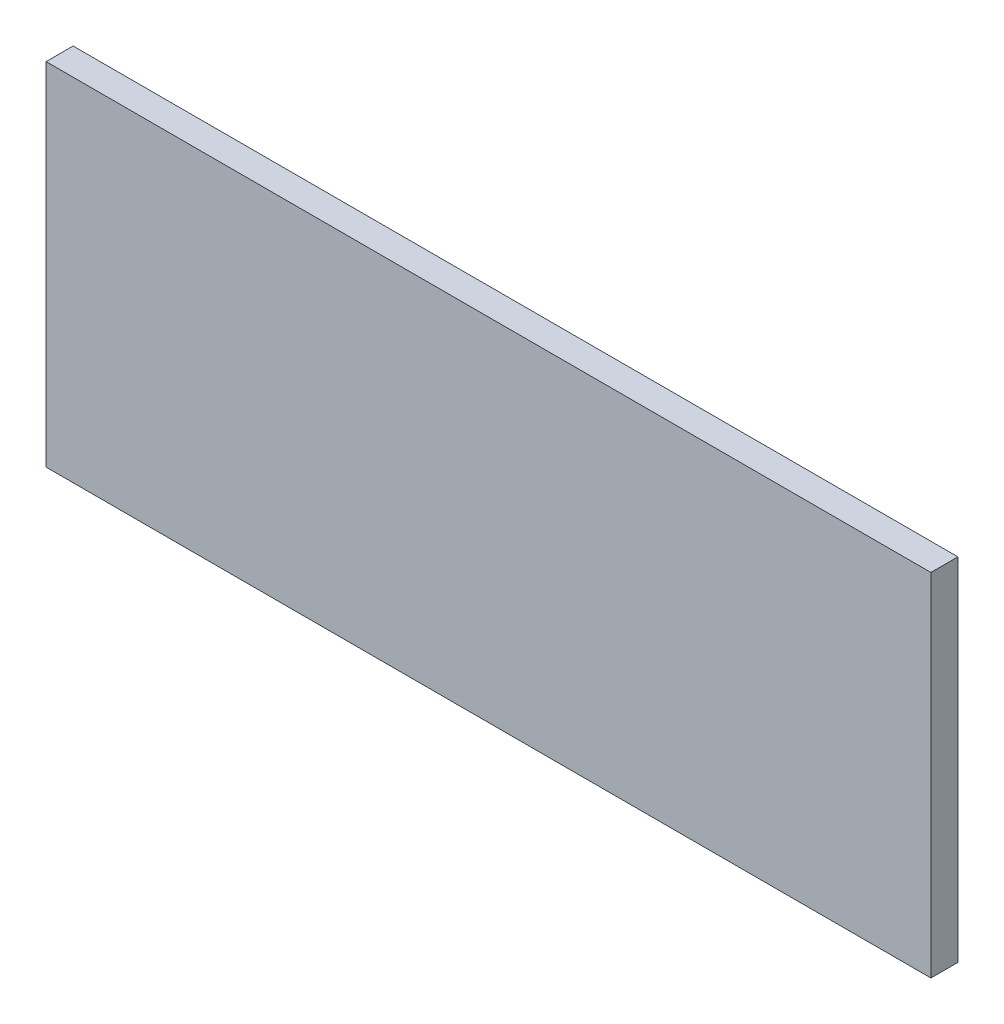
ISO-10303-21;
HEADER;
FILE_DESCRIPTION(('STEP AP214'),'2;1');
FILE_NAME('part.step','',(''),(''),'','','');
FILE_SCHEMA(('AUTOMOTIVE_DESIGN { 1 0 10303 214 1 1 1 1 }'));
ENDSEC;
DATA;
#1=APPLICATION_CONTEXT('core data for automotive mechanical design processes');
#2=APPLICATION_PROTOCOL_DEFINITION('international standard','automotive_design',2000,#1);
#3=PRODUCT_CONTEXT('',#1,'mechanical');
#4=PRODUCT('Part','Part','',(#3));
#5=PRODUCT_RELATED_PRODUCT_CATEGORY('part','',(#4));
#6=PRODUCT_DEFINITION_FORMATION('','',#4);
#7=PRODUCT_DEFINITION_CONTEXT('part definition',#1,'design');
#8=PRODUCT_DEFINITION('design','',#6,#7);
#9=PRODUCT_DEFINITION_SHAPE('','',#8);
#10=(LENGTH_UNIT() NAMED_UNIT(*) SI_UNIT(.MILLI.,.METRE.));
#11=(NAMED_UNIT(*) PLANE_ANGLE_UNIT() SI_UNIT($,.RADIAN.));
#12=(NAMED_UNIT(*) SI_UNIT($,.STERADIAN.) SOLID_ANGLE_UNIT());
#13=UNCERTAINTY_MEASURE_WITH_UNIT(LENGTH_MEASURE(1.E-05),#10,'distance_accuracy_value','');
#14=(GEOMETRIC_REPRESENTATION_CONTEXT(3) GLOBAL_UNCERTAINTY_ASSIGNED_CONTEXT((#13)) GLOBAL_UNIT_ASSIGNED_CONTEXT((#10,
#11,#12)) REPRESENTATION_CONTEXT('',''));
#15=CARTESIAN_POINT('',(0.,0.,0.));
#16=DIRECTION('',(0.,0.,1.));
#17=DIRECTION('',(1.,0.,0.));
#18=AXIS2_PLACEMENT_3D('',#15,#16,#17);
#19=CARTESIAN_POINT('',(0.,0.,4.));
#20=DIRECTION('',(1.,0.,0.));
#21=DIRECTION('',(0.,1.,0.));
#22=AXIS2_PLACEMENT_3D('',#19,#20,#21);
#23=PLANE('',#22);
#24=DIRECTION('',(0.,-1.,0.));
#25=VECTOR('',#24,1.);
#26=CARTESIAN_POINT('',(0.,0.,0.));
#27=LINE('',#26,#25);
#28=CARTESIAN_POINT('',(0.,0.,0.));
#29=VERTEX_POINT('',#28);
#30=CARTESIAN_POINT('',(0.,-52.,0.));
#31=VERTEX_POINT('',#30);
#32=EDGE_CURVE('E113',#29,#31,#27,.T.);
#33=ORIENTED_EDGE('',*,*,#32,.T.);
#34=DIRECTION('',(0.,0.,-1.));
#35=VECTOR('',#34,1.);
#36=CARTESIAN_POINT('',(0.,-52.,4.));
#37=LINE('',#36,#35);
#38=CARTESIAN_POINT('',(0.,-52.,4.));
#39=VERTEX_POINT('',#38);
#40=EDGE_CURVE('E11',#39,#31,#37,.T.);
#41=ORIENTED_EDGE('',*,*,#40,.F.);
#42=DIRECTION('',(0.,-1.,0.));
#43=VECTOR('',#42,1.);
#44=CARTESIAN_POINT('',(0.,0.,4.));
#45=LINE('',#44,#43);
#46=CARTESIAN_POINT('',(0.,0.,4.));
#47=VERTEX_POINT('',#46);
#48=EDGE_CURVE('E97',#47,#39,#45,.T.);
#49=ORIENTED_EDGE('',*,*,#48,.F.);
#50=DIRECTION('',(0.,0.,-1.));
#51=VECTOR('',#50,1.);
#52=CARTESIAN_POINT('',(0.,0.,4.));
#53=LINE('',#52,#51);
#54=EDGE_CURVE('E109',#47,#29,#53,.T.);
#55=ORIENTED_EDGE('',*,*,#54,.T.);
#56=EDGE_LOOP('',(#33,#41,#49,#55));
#57=FACE_BOUND('',#56,.T.);
#58=ADVANCED_FACE('F45',(#57),#23,.F.);
#59=CARTESIAN_POINT('',(0.,-52.,4.));
#60=DIRECTION('',(0.,1.,0.));
#61=DIRECTION('',(0.,0.,1.));
#62=AXIS2_PLACEMENT_3D('',#59,#60,#61);
#63=PLANE('',#62);
#64=DIRECTION('',(1.,0.,0.));
#65=VECTOR('',#64,1.);
#66=CARTESIAN_POINT('',(0.,-52.,0.));
#67=LINE('',#66,#65);
#68=CARTESIAN_POINT('',(131.,-52.,0.));
#69=VERTEX_POINT('',#68);
#70=EDGE_CURVE('E102',#31,#69,#67,.T.);
#71=ORIENTED_EDGE('',*,*,#70,.T.);
#72=DIRECTION('',(0.,0.,-1.));
#73=VECTOR('',#72,1.);
#74=CARTESIAN_POINT('',(131.,-52.,4.));
#75=LINE('',#74,#73);
#76=CARTESIAN_POINT('',(131.,-52.,4.));
#77=VERTEX_POINT('',#76);
#78=EDGE_CURVE('E54',#77,#69,#75,.T.);
#79=ORIENTED_EDGE('',*,*,#78,.F.);
#80=DIRECTION('',(1.,0.,0.));
#81=VECTOR('',#80,1.);
#82=CARTESIAN_POINT('',(0.,-52.,4.));
#83=LINE('',#82,#81);
#84=EDGE_CURVE('E92',#39,#77,#83,.T.);
#85=ORIENTED_EDGE('',*,*,#84,.F.);
#86=ORIENTED_EDGE('',*,*,#40,.T.);
#87=EDGE_LOOP('',(#71,#79,#85,#86));
#88=FACE_BOUND('',#87,.T.);
#89=ADVANCED_FACE('F101',(#88),#63,.F.);
#90=CARTESIAN_POINT('',(131.,0.,4.));
#91=DIRECTION('',(-1.,0.,0.));
#92=DIRECTION('',(0.,0.,1.));
#93=AXIS2_PLACEMENT_3D('',#90,#91,#92);
#94=PLANE('',#93);
#95=DIRECTION('',(0.,1.,0.));
#96=VECTOR('',#95,1.);
#97=CARTESIAN_POINT('',(131.,0.,0.));
#98=LINE('',#97,#96);
#99=CARTESIAN_POINT('',(131.,0.,0.));
#100=VERTEX_POINT('',#99);
#101=EDGE_CURVE('E79',#69,#100,#98,.T.);
#102=ORIENTED_EDGE('',*,*,#101,.T.);
#103=DIRECTION('',(0.,0.,-1.));
#104=VECTOR('',#103,1.);
#105=CARTESIAN_POINT('',(131.,0.,4.));
#106=LINE('',#105,#104);
#107=CARTESIAN_POINT('',(131.,0.,4.));
#108=VERTEX_POINT('',#107);
#109=EDGE_CURVE('E104',#108,#100,#106,.T.);
#110=ORIENTED_EDGE('',*,*,#109,.F.);
#111=DIRECTION('',(0.,1.,0.));
#112=VECTOR('',#111,1.);
#113=CARTESIAN_POINT('',(131.,0.,4.));
#114=LINE('',#113,#112);
#115=EDGE_CURVE('E95',#77,#108,#114,.T.);
#116=ORIENTED_EDGE('',*,*,#115,.F.);
#117=ORIENTED_EDGE('',*,*,#78,.T.);
#118=EDGE_LOOP('',(#102,#110,#116,#117));
#119=FACE_BOUND('',#118,.T.);
#120=ADVANCED_FACE('F105',(#119),#94,.F.);
#121=CARTESIAN_POINT('',(0.,0.,4.));
#122=DIRECTION('',(0.,-1.,0.));
#123=DIRECTION('',(0.,0.,-1.));
#124=AXIS2_PLACEMENT_3D('',#121,#122,#123);
#125=PLANE('',#124);
#126=DIRECTION('',(-1.,0.,0.));
#127=VECTOR('',#126,1.);
#128=CARTESIAN_POINT('',(0.,0.,0.));
#129=LINE('',#128,#127);
#130=EDGE_CURVE('E85',#100,#29,#129,.T.);
#131=ORIENTED_EDGE('',*,*,#130,.T.);
#132=ORIENTED_EDGE('',*,*,#54,.F.);
#133=DIRECTION('',(-1.,0.,0.));
#134=VECTOR('',#133,1.);
#135=CARTESIAN_POINT('',(0.,0.,4.));
#136=LINE('',#135,#134);
#137=EDGE_CURVE('E62',#108,#47,#136,.T.);
#138=ORIENTED_EDGE('',*,*,#137,.F.);
#139=ORIENTED_EDGE('',*,*,#109,.T.);
#140=EDGE_LOOP('',(#131,#132,#138,#139));
#141=FACE_BOUND('',#140,.T.);
#142=ADVANCED_FACE('F126',(#141),#125,.F.);
#143=CARTESIAN_POINT('',(0.,0.,4.));
#144=DIRECTION('',(0.,0.,1.));
#145=DIRECTION('',(1.,0.,0.));
#146=AXIS2_PLACEMENT_3D('',#143,#144,#145);
#147=PLANE('',#146);
#148=ORIENTED_EDGE('',*,*,#48,.T.);
#149=ORIENTED_EDGE('',*,*,#84,.T.);
#150=ORIENTED_EDGE('',*,*,#115,.T.);
#151=ORIENTED_EDGE('',*,*,#137,.T.);
#152=EDGE_LOOP('',(#148,#149,#150,#151));
#153=FACE_BOUND('',#152,.T.);
#154=ADVANCED_FACE('F93',(#153),#147,.T.);
#155=CARTESIAN_POINT('',(0.,0.,0.));
#156=DIRECTION('',(0.,0.,1.));
#157=DIRECTION('',(1.,0.,0.));
#158=AXIS2_PLACEMENT_3D('',#155,#156,#157);
#159=PLANE('',#158);
#160=ORIENTED_EDGE('',*,*,#32,.F.);
#161=ORIENTED_EDGE('',*,*,#130,.F.);
#162=ORIENTED_EDGE('',*,*,#101,.F.);
#163=ORIENTED_EDGE('',*,*,#70,.F.);
#164=EDGE_LOOP('',(#160,#161,#162,#163));
#165=FACE_BOUND('',#164,.T.);
#166=ADVANCED_FACE('F129',(#165),#159,.F.);
#167=CLOSED_SHELL('',(#58,#89,#120,#142,#154,#166));
#168=MANIFOLD_SOLID_BREP('B2',#167);
#169=ADVANCED_BREP_SHAPE_REPRESENTATION('',(#18,#168),#14);
#170=SHAPE_DEFINITION_REPRESENTATION(#9,#169);
ENDSEC;
END-ISO-10303-21;
